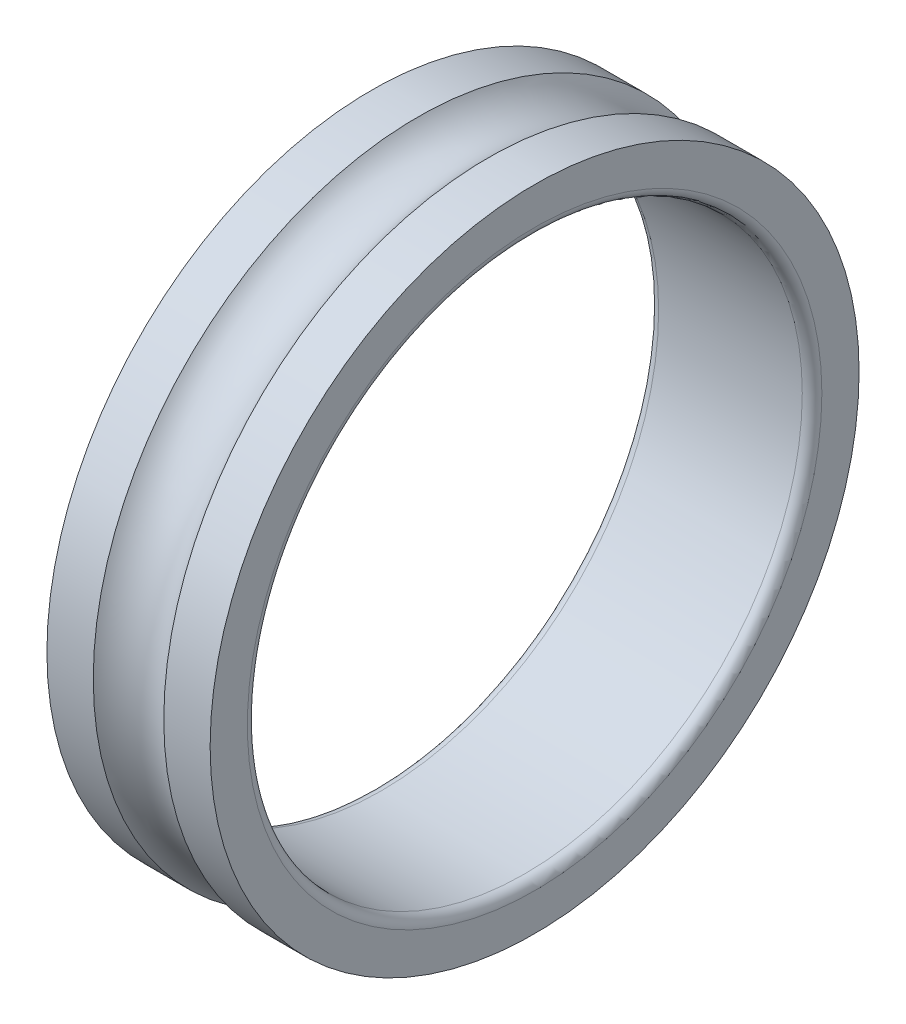
ISO-10303-21;
HEADER;
FILE_DESCRIPTION(('STEP AP214'),'2;1');
FILE_NAME('part.step','',(''),(''),'','','');
FILE_SCHEMA(('AUTOMOTIVE_DESIGN { 1 0 10303 214 1 1 1 1 }'));
ENDSEC;
DATA;
#1=APPLICATION_CONTEXT('core data for automotive mechanical design processes');
#2=APPLICATION_PROTOCOL_DEFINITION('international standard','automotive_design',2000,#1);
#3=PRODUCT_CONTEXT('',#1,'mechanical');
#4=PRODUCT('Part','Part','',(#3));
#5=PRODUCT_RELATED_PRODUCT_CATEGORY('part','',(#4));
#6=PRODUCT_DEFINITION_FORMATION('','',#4);
#7=PRODUCT_DEFINITION_CONTEXT('part definition',#1,'design');
#8=PRODUCT_DEFINITION('design','',#6,#7);
#9=PRODUCT_DEFINITION_SHAPE('','',#8);
#10=(LENGTH_UNIT() NAMED_UNIT(*) SI_UNIT(.MILLI.,.METRE.));
#11=(NAMED_UNIT(*) PLANE_ANGLE_UNIT() SI_UNIT($,.RADIAN.));
#12=(NAMED_UNIT(*) SI_UNIT($,.STERADIAN.) SOLID_ANGLE_UNIT());
#13=UNCERTAINTY_MEASURE_WITH_UNIT(LENGTH_MEASURE(1.E-05),#10,'distance_accuracy_value','');
#14=(GEOMETRIC_REPRESENTATION_CONTEXT(3) GLOBAL_UNCERTAINTY_ASSIGNED_CONTEXT((#13)) GLOBAL_UNIT_ASSIGNED_CONTEXT((#10,
#11,#12)) REPRESENTATION_CONTEXT('',''));
#15=CARTESIAN_POINT('',(0.,0.,0.));
#16=DIRECTION('',(0.,0.,1.));
#17=DIRECTION('',(1.,0.,0.));
#18=AXIS2_PLACEMENT_3D('',#15,#16,#17);
#19=CARTESIAN_POINT('',(5.,0.,0.));
#20=DIRECTION('',(1.,0.,0.));
#21=DIRECTION('',(0.,0.,-1.));
#22=AXIS2_PLACEMENT_3D('',#19,#20,#21);
#23=CYLINDRICAL_SURFACE('',#22,9.94);
#24=CARTESIAN_POINT('',(0.,0.,0.));
#25=DIRECTION('',(1.,0.,0.));
#26=DIRECTION('',(0.,0.,-1.));
#27=AXIS2_PLACEMENT_3D('',#24,#25,#26);
#28=CIRCLE('',#27,9.94);
#29=CARTESIAN_POINT('',(0.,0.,-9.94));
#30=VERTEX_POINT('',#29);
#31=EDGE_CURVE('E56',#30,#30,#28,.T.);
#32=ORIENTED_EDGE('',*,*,#31,.T.);
#33=EDGE_LOOP('',(#32));
#34=FACE_BOUND('',#33,.T.);
#35=CARTESIAN_POINT('',(1.42,0.,0.));
#36=DIRECTION('',(1.,0.,0.));
#37=DIRECTION('',(0.,0.,-1.));
#38=AXIS2_PLACEMENT_3D('',#35,#36,#37);
#39=CIRCLE('',#38,9.94);
#40=CARTESIAN_POINT('',(1.42,0.,-9.94));
#41=VERTEX_POINT('',#40);
#42=EDGE_CURVE('E10',#41,#41,#39,.T.);
#43=ORIENTED_EDGE('',*,*,#42,.F.);
#44=EDGE_LOOP('',(#43));
#45=FACE_BOUND('',#44,.T.);
#46=ADVANCED_FACE('F15',(#34,#45),#23,.T.);
#47=CARTESIAN_POINT('',(2.5,0.,0.));
#48=DIRECTION('',(1.,0.,0.));
#49=DIRECTION('',(0.,0.,-1.));
#50=AXIS2_PLACEMENT_3D('',#47,#48,#49);
#51=TOROIDAL_SURFACE('',#50,10.75,1.35);
#52=ORIENTED_EDGE('',*,*,#42,.T.);
#53=EDGE_LOOP('',(#52));
#54=FACE_BOUND('',#53,.T.);
#55=CARTESIAN_POINT('',(3.58,0.,0.));
#56=DIRECTION('',(1.,0.,0.));
#57=DIRECTION('',(0.,0.,-1.));
#58=AXIS2_PLACEMENT_3D('',#55,#56,#57);
#59=CIRCLE('',#58,9.94);
#60=CARTESIAN_POINT('',(3.58,0.,-9.94));
#61=VERTEX_POINT('',#60);
#62=EDGE_CURVE('E22',#61,#61,#59,.T.);
#63=ORIENTED_EDGE('',*,*,#62,.F.);
#64=EDGE_LOOP('',(#63));
#65=FACE_BOUND('',#64,.T.);
#66=ADVANCED_FACE('F78',(#54,#65),#51,.F.);
#67=CARTESIAN_POINT('',(5.,0.,0.));
#68=DIRECTION('',(1.,0.,0.));
#69=DIRECTION('',(0.,0.,-1.));
#70=AXIS2_PLACEMENT_3D('',#67,#68,#69);
#71=CYLINDRICAL_SURFACE('',#70,9.94);
#72=ORIENTED_EDGE('',*,*,#62,.T.);
#73=EDGE_LOOP('',(#72));
#74=FACE_BOUND('',#73,.T.);
#75=CARTESIAN_POINT('',(5.,0.,0.));
#76=DIRECTION('',(1.,0.,0.));
#77=DIRECTION('',(0.,0.,-1.));
#78=AXIS2_PLACEMENT_3D('',#75,#76,#77);
#79=CIRCLE('',#78,9.94);
#80=CARTESIAN_POINT('',(5.,0.,-9.94));
#81=VERTEX_POINT('',#80);
#82=EDGE_CURVE('E31',#81,#81,#79,.T.);
#83=ORIENTED_EDGE('',*,*,#82,.F.);
#84=EDGE_LOOP('',(#83));
#85=FACE_BOUND('',#84,.T.);
#86=ADVANCED_FACE('F82',(#74,#85),#71,.T.);
#87=CARTESIAN_POINT('',(5.,8.8,0.));
#88=DIRECTION('',(1.,0.,0.));
#89=DIRECTION('',(0.,1.,0.));
#90=AXIS2_PLACEMENT_3D('',#87,#88,#89);
#91=PLANE('',#90);
#92=CARTESIAN_POINT('',(5.,0.,0.));
#93=DIRECTION('',(1.,0.,0.));
#94=DIRECTION('',(0.,0.,-1.));
#95=AXIS2_PLACEMENT_3D('',#92,#93,#94);
#96=CIRCLE('',#95,8.8);
#97=CARTESIAN_POINT('',(5.,0.,-8.8));
#98=VERTEX_POINT('',#97);
#99=EDGE_CURVE('E38',#98,#98,#96,.T.);
#100=ORIENTED_EDGE('',*,*,#99,.F.);
#101=EDGE_LOOP('',(#100));
#102=FACE_BOUND('',#101,.T.);
#103=ORIENTED_EDGE('',*,*,#82,.T.);
#104=EDGE_LOOP('',(#103));
#105=FACE_BOUND('',#104,.T.);
#106=ADVANCED_FACE('F86',(#102,#105),#91,.T.);
#107=CARTESIAN_POINT('',(4.7,0.,0.));
#108=DIRECTION('',(1.,0.,0.));
#109=DIRECTION('',(0.,0.,-1.));
#110=AXIS2_PLACEMENT_3D('',#107,#108,#109);
#111=TOROIDAL_SURFACE('',#110,8.8,0.3);
#112=ORIENTED_EDGE('',*,*,#99,.T.);
#113=EDGE_LOOP('',(#112));
#114=FACE_BOUND('',#113,.T.);
#115=CARTESIAN_POINT('',(4.7,0.,0.));
#116=DIRECTION('',(1.,0.,0.));
#117=DIRECTION('',(0.,0.,-1.));
#118=AXIS2_PLACEMENT_3D('',#115,#116,#117);
#119=CIRCLE('',#118,8.5);
#120=CARTESIAN_POINT('',(4.7,0.,-8.5));
#121=VERTEX_POINT('',#120);
#122=EDGE_CURVE('E41',#121,#121,#119,.T.);
#123=ORIENTED_EDGE('',*,*,#122,.F.);
#124=EDGE_LOOP('',(#123));
#125=FACE_BOUND('',#124,.T.);
#126=ADVANCED_FACE('F90',(#114,#125),#111,.T.);
#127=CARTESIAN_POINT('',(5.,0.,0.));
#128=DIRECTION('',(1.,0.,0.));
#129=DIRECTION('',(0.,0.,-1.));
#130=AXIS2_PLACEMENT_3D('',#127,#128,#129);
#131=CYLINDRICAL_SURFACE('',#130,8.5);
#132=ORIENTED_EDGE('',*,*,#122,.T.);
#133=EDGE_LOOP('',(#132));
#134=FACE_BOUND('',#133,.T.);
#135=CARTESIAN_POINT('',(0.3,0.,0.));
#136=DIRECTION('',(1.,0.,0.));
#137=DIRECTION('',(0.,0.,-1.));
#138=AXIS2_PLACEMENT_3D('',#135,#136,#137);
#139=CIRCLE('',#138,8.5);
#140=CARTESIAN_POINT('',(0.3,0.,-8.5));
#141=VERTEX_POINT('',#140);
#142=EDGE_CURVE('E45',#141,#141,#139,.T.);
#143=ORIENTED_EDGE('',*,*,#142,.F.);
#144=EDGE_LOOP('',(#143));
#145=FACE_BOUND('',#144,.T.);
#146=ADVANCED_FACE('F74',(#134,#145),#131,.F.);
#147=CARTESIAN_POINT('',(0.3,0.,0.));
#148=DIRECTION('',(1.,0.,0.));
#149=DIRECTION('',(0.,0.,-1.));
#150=AXIS2_PLACEMENT_3D('',#147,#148,#149);
#151=TOROIDAL_SURFACE('',#150,8.8,0.3);
#152=ORIENTED_EDGE('',*,*,#142,.T.);
#153=EDGE_LOOP('',(#152));
#154=FACE_BOUND('',#153,.T.);
#155=CARTESIAN_POINT('',(0.,0.,0.));
#156=DIRECTION('',(1.,0.,0.));
#157=DIRECTION('',(0.,0.,-1.));
#158=AXIS2_PLACEMENT_3D('',#155,#156,#157);
#159=CIRCLE('',#158,8.8);
#160=CARTESIAN_POINT('',(0.,0.,-8.8));
#161=VERTEX_POINT('',#160);
#162=EDGE_CURVE('E52',#161,#161,#159,.T.);
#163=ORIENTED_EDGE('',*,*,#162,.F.);
#164=EDGE_LOOP('',(#163));
#165=FACE_BOUND('',#164,.T.);
#166=ADVANCED_FACE('F67',(#154,#165),#151,.T.);
#167=CARTESIAN_POINT('',(0.,9.94,0.));
#168=DIRECTION('',(-1.,0.,0.));
#169=DIRECTION('',(0.,0.,1.));
#170=AXIS2_PLACEMENT_3D('',#167,#168,#169);
#171=PLANE('',#170);
#172=ORIENTED_EDGE('',*,*,#162,.T.);
#173=EDGE_LOOP('',(#172));
#174=FACE_BOUND('',#173,.T.);
#175=ORIENTED_EDGE('',*,*,#31,.F.);
#176=EDGE_LOOP('',(#175));
#177=FACE_BOUND('',#176,.T.);
#178=ADVANCED_FACE('F65',(#174,#177),#171,.T.);
#179=CLOSED_SHELL('',(#46,#66,#86,#106,#126,#146,#166,#178));
#180=MANIFOLD_SOLID_BREP('B1',#179);
#181=ADVANCED_BREP_SHAPE_REPRESENTATION('',(#18,#180),#14);
#182=SHAPE_DEFINITION_REPRESENTATION(#9,#181);
ENDSEC;
END-ISO-10303-21;
